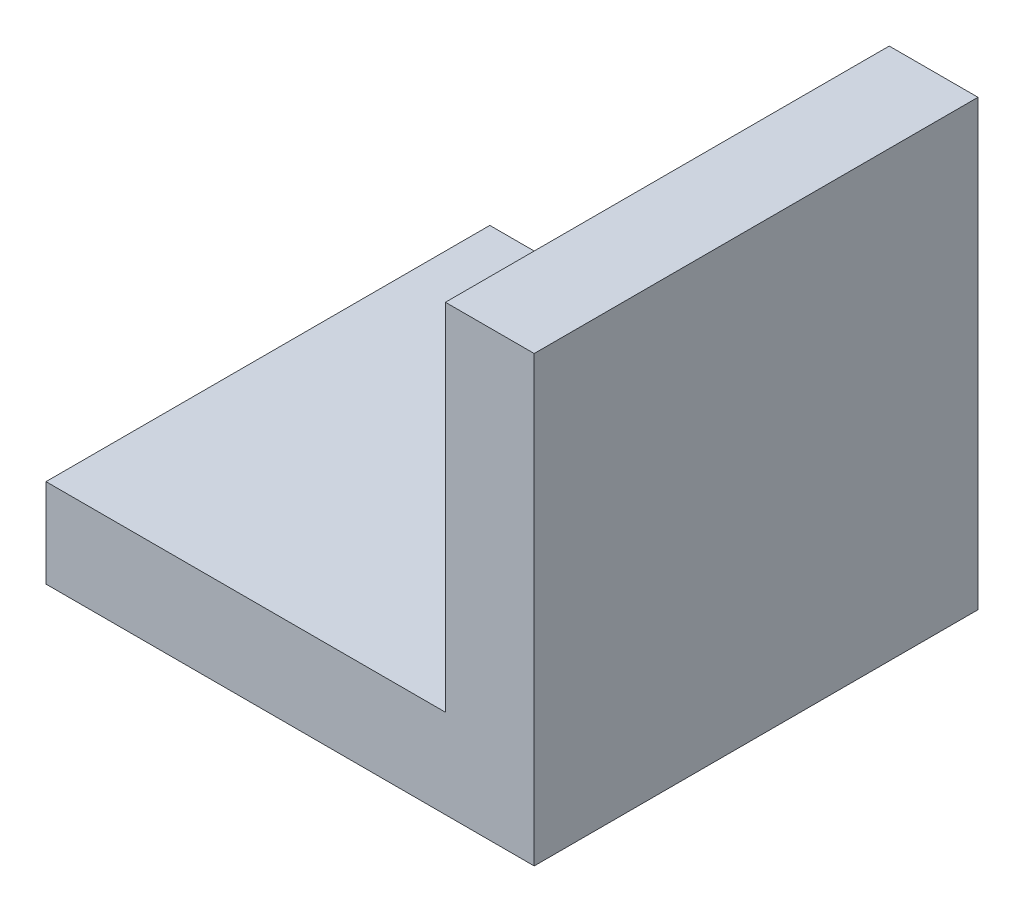
ISO-10303-21;
HEADER;
FILE_DESCRIPTION(('STEP AP214'),'2;1');
FILE_NAME('part.step','',(''),(''),'','','');
FILE_SCHEMA(('AUTOMOTIVE_DESIGN { 1 0 10303 214 1 1 1 1 }'));
ENDSEC;
DATA;
#1=APPLICATION_CONTEXT('core data for automotive mechanical design processes');
#2=APPLICATION_PROTOCOL_DEFINITION('international standard','automotive_design',2000,#1);
#3=PRODUCT_CONTEXT('',#1,'mechanical');
#4=PRODUCT('Part','Part','',(#3));
#5=PRODUCT_RELATED_PRODUCT_CATEGORY('part','',(#4));
#6=PRODUCT_DEFINITION_FORMATION('','',#4);
#7=PRODUCT_DEFINITION_CONTEXT('part definition',#1,'design');
#8=PRODUCT_DEFINITION('design','',#6,#7);
#9=PRODUCT_DEFINITION_SHAPE('','',#8);
#10=(LENGTH_UNIT() NAMED_UNIT(*) SI_UNIT(.MILLI.,.METRE.));
#11=(NAMED_UNIT(*) PLANE_ANGLE_UNIT() SI_UNIT($,.RADIAN.));
#12=(NAMED_UNIT(*) SI_UNIT($,.STERADIAN.) SOLID_ANGLE_UNIT());
#13=UNCERTAINTY_MEASURE_WITH_UNIT(LENGTH_MEASURE(1.E-05),#10,'distance_accuracy_value','');
#14=(GEOMETRIC_REPRESENTATION_CONTEXT(3) GLOBAL_UNCERTAINTY_ASSIGNED_CONTEXT((#13)) GLOBAL_UNIT_ASSIGNED_CONTEXT((#10,
#11,#12)) REPRESENTATION_CONTEXT('',''));
#15=CARTESIAN_POINT('',(0.,0.,0.));
#16=DIRECTION('',(0.,0.,1.));
#17=DIRECTION('',(1.,0.,0.));
#18=AXIS2_PLACEMENT_3D('',#15,#16,#17);
#19=CARTESIAN_POINT('',(0.,50.,50.));
#20=DIRECTION('',(-1.,0.,0.));
#21=DIRECTION('',(0.,0.,1.));
#22=AXIS2_PLACEMENT_3D('',#19,#20,#21);
#23=PLANE('',#22);
#24=DIRECTION('',(0.,1.,0.));
#25=VECTOR('',#24,1.);
#26=CARTESIAN_POINT('',(0.,50.,0.));
#27=LINE('',#26,#25);
#28=CARTESIAN_POINT('',(0.,0.,0.));
#29=VERTEX_POINT('',#28);
#30=CARTESIAN_POINT('',(0.,50.,0.));
#31=VERTEX_POINT('',#30);
#32=EDGE_CURVE('E117',#29,#31,#27,.T.);
#33=ORIENTED_EDGE('',*,*,#32,.T.);
#34=DIRECTION('',(0.,0.,-1.));
#35=VECTOR('',#34,1.);
#36=CARTESIAN_POINT('',(0.,50.,50.));
#37=LINE('',#36,#35);
#38=CARTESIAN_POINT('',(0.,50.,50.));
#39=VERTEX_POINT('',#38);
#40=EDGE_CURVE('E11',#39,#31,#37,.T.);
#41=ORIENTED_EDGE('',*,*,#40,.F.);
#42=DIRECTION('',(0.,1.,0.));
#43=VECTOR('',#42,1.);
#44=CARTESIAN_POINT('',(0.,50.,50.));
#45=LINE('',#44,#43);
#46=CARTESIAN_POINT('',(0.,0.,50.));
#47=VERTEX_POINT('',#46);
#48=EDGE_CURVE('E127',#47,#39,#45,.T.);
#49=ORIENTED_EDGE('',*,*,#48,.F.);
#50=DIRECTION('',(0.,0.,-1.));
#51=VECTOR('',#50,1.);
#52=CARTESIAN_POINT('',(0.,0.,50.));
#53=LINE('',#52,#51);
#54=EDGE_CURVE('E113',#47,#29,#53,.T.);
#55=ORIENTED_EDGE('',*,*,#54,.T.);
#56=EDGE_LOOP('',(#33,#41,#49,#55));
#57=FACE_BOUND('',#56,.T.);
#58=ADVANCED_FACE('F33',(#57),#23,.F.);
#59=CARTESIAN_POINT('',(-10.,50.,50.));
#60=DIRECTION('',(0.,-1.,0.));
#61=DIRECTION('',(0.,0.,-1.));
#62=AXIS2_PLACEMENT_3D('',#59,#60,#61);
#63=PLANE('',#62);
#64=DIRECTION('',(-1.,0.,0.));
#65=VECTOR('',#64,1.);
#66=CARTESIAN_POINT('',(-10.,50.,0.));
#67=LINE('',#66,#65);
#68=CARTESIAN_POINT('',(-10.,50.,0.));
#69=VERTEX_POINT('',#68);
#70=EDGE_CURVE('E120',#31,#69,#67,.T.);
#71=ORIENTED_EDGE('',*,*,#70,.T.);
#72=DIRECTION('',(0.,0.,-1.));
#73=VECTOR('',#72,1.);
#74=CARTESIAN_POINT('',(-10.,50.,50.));
#75=LINE('',#74,#73);
#76=CARTESIAN_POINT('',(-10.,50.,50.));
#77=VERTEX_POINT('',#76);
#78=EDGE_CURVE('E41',#77,#69,#75,.T.);
#79=ORIENTED_EDGE('',*,*,#78,.F.);
#80=DIRECTION('',(-1.,0.,0.));
#81=VECTOR('',#80,1.);
#82=CARTESIAN_POINT('',(-10.,50.,50.));
#83=LINE('',#82,#81);
#84=EDGE_CURVE('E86',#39,#77,#83,.T.);
#85=ORIENTED_EDGE('',*,*,#84,.F.);
#86=ORIENTED_EDGE('',*,*,#40,.T.);
#87=EDGE_LOOP('',(#71,#79,#85,#86));
#88=FACE_BOUND('',#87,.T.);
#89=ADVANCED_FACE('F151',(#88),#63,.F.);
#90=CARTESIAN_POINT('',(-10.,9.99999999999999,50.));
#91=DIRECTION('',(1.,0.,0.));
#92=DIRECTION('',(0.,1.,0.));
#93=AXIS2_PLACEMENT_3D('',#90,#91,#92);
#94=PLANE('',#93);
#95=DIRECTION('',(0.,-1.,0.));
#96=VECTOR('',#95,1.);
#97=CARTESIAN_POINT('',(-10.,9.99999999999999,0.));
#98=LINE('',#97,#96);
#99=CARTESIAN_POINT('',(-10.,9.99999999999999,0.));
#100=VERTEX_POINT('',#99);
#101=EDGE_CURVE('E122',#69,#100,#98,.T.);
#102=ORIENTED_EDGE('',*,*,#101,.T.);
#103=DIRECTION('',(0.,0.,-1.));
#104=VECTOR('',#103,1.);
#105=CARTESIAN_POINT('',(-10.,9.99999999999999,50.));
#106=LINE('',#105,#104);
#107=CARTESIAN_POINT('',(-10.,9.99999999999999,50.));
#108=VERTEX_POINT('',#107);
#109=EDGE_CURVE('E108',#108,#100,#106,.T.);
#110=ORIENTED_EDGE('',*,*,#109,.F.);
#111=DIRECTION('',(0.,-1.,0.));
#112=VECTOR('',#111,1.);
#113=CARTESIAN_POINT('',(-10.,9.99999999999999,50.));
#114=LINE('',#113,#112);
#115=EDGE_CURVE('E99',#77,#108,#114,.T.);
#116=ORIENTED_EDGE('',*,*,#115,.F.);
#117=ORIENTED_EDGE('',*,*,#78,.T.);
#118=EDGE_LOOP('',(#102,#110,#116,#117));
#119=FACE_BOUND('',#118,.T.);
#120=ADVANCED_FACE('F133',(#119),#94,.F.);
#121=CARTESIAN_POINT('',(-55.,9.99999999999999,50.));
#122=DIRECTION('',(0.,-1.,0.));
#123=DIRECTION('',(0.,0.,-1.));
#124=AXIS2_PLACEMENT_3D('',#121,#122,#123);
#125=PLANE('',#124);
#126=DIRECTION('',(-1.,0.,0.));
#127=VECTOR('',#126,1.);
#128=CARTESIAN_POINT('',(-55.,9.99999999999999,0.));
#129=LINE('',#128,#127);
#130=CARTESIAN_POINT('',(-55.,9.99999999999999,0.));
#131=VERTEX_POINT('',#130);
#132=EDGE_CURVE('E107',#100,#131,#129,.T.);
#133=ORIENTED_EDGE('',*,*,#132,.T.);
#134=DIRECTION('',(0.,0.,-1.));
#135=VECTOR('',#134,1.);
#136=CARTESIAN_POINT('',(-55.,9.99999999999999,50.));
#137=LINE('',#136,#135);
#138=CARTESIAN_POINT('',(-55.,9.99999999999999,50.));
#139=VERTEX_POINT('',#138);
#140=EDGE_CURVE('E104',#139,#131,#137,.T.);
#141=ORIENTED_EDGE('',*,*,#140,.F.);
#142=DIRECTION('',(-1.,0.,0.));
#143=VECTOR('',#142,1.);
#144=CARTESIAN_POINT('',(-55.,9.99999999999999,50.));
#145=LINE('',#144,#143);
#146=EDGE_CURVE('E93',#108,#139,#145,.T.);
#147=ORIENTED_EDGE('',*,*,#146,.F.);
#148=ORIENTED_EDGE('',*,*,#109,.T.);
#149=EDGE_LOOP('',(#133,#141,#147,#148));
#150=FACE_BOUND('',#149,.T.);
#151=ADVANCED_FACE('F105',(#150),#125,.F.);
#152=CARTESIAN_POINT('',(-55.,0.,50.));
#153=DIRECTION('',(1.,0.,0.));
#154=DIRECTION('',(0.,0.,-1.));
#155=AXIS2_PLACEMENT_3D('',#152,#153,#154);
#156=PLANE('',#155);
#157=DIRECTION('',(0.,-1.,0.));
#158=VECTOR('',#157,1.);
#159=CARTESIAN_POINT('',(-55.,0.,0.));
#160=LINE('',#159,#158);
#161=CARTESIAN_POINT('',(-55.,0.,0.));
#162=VERTEX_POINT('',#161);
#163=EDGE_CURVE('E72',#131,#162,#160,.T.);
#164=ORIENTED_EDGE('',*,*,#163,.T.);
#165=DIRECTION('',(0.,0.,-1.));
#166=VECTOR('',#165,1.);
#167=CARTESIAN_POINT('',(-55.,0.,50.));
#168=LINE('',#167,#166);
#169=CARTESIAN_POINT('',(-55.,0.,50.));
#170=VERTEX_POINT('',#169);
#171=EDGE_CURVE('E109',#170,#162,#168,.T.);
#172=ORIENTED_EDGE('',*,*,#171,.F.);
#173=DIRECTION('',(0.,-1.,0.));
#174=VECTOR('',#173,1.);
#175=CARTESIAN_POINT('',(-55.,0.,50.));
#176=LINE('',#175,#174);
#177=EDGE_CURVE('E97',#139,#170,#176,.T.);
#178=ORIENTED_EDGE('',*,*,#177,.F.);
#179=ORIENTED_EDGE('',*,*,#140,.T.);
#180=EDGE_LOOP('',(#164,#172,#178,#179));
#181=FACE_BOUND('',#180,.T.);
#182=ADVANCED_FACE('F111',(#181),#156,.F.);
#183=CARTESIAN_POINT('',(0.,0.,50.));
#184=DIRECTION('',(0.,1.,0.));
#185=DIRECTION('',(0.,0.,1.));
#186=AXIS2_PLACEMENT_3D('',#183,#184,#185);
#187=PLANE('',#186);
#188=DIRECTION('',(1.,0.,0.));
#189=VECTOR('',#188,1.);
#190=CARTESIAN_POINT('',(0.,0.,0.));
#191=LINE('',#190,#189);
#192=EDGE_CURVE('E78',#162,#29,#191,.T.);
#193=ORIENTED_EDGE('',*,*,#192,.T.);
#194=ORIENTED_EDGE('',*,*,#54,.F.);
#195=DIRECTION('',(1.,0.,0.));
#196=VECTOR('',#195,1.);
#197=CARTESIAN_POINT('',(0.,0.,50.));
#198=LINE('',#197,#196);
#199=EDGE_CURVE('E49',#170,#47,#198,.T.);
#200=ORIENTED_EDGE('',*,*,#199,.F.);
#201=ORIENTED_EDGE('',*,*,#171,.T.);
#202=EDGE_LOOP('',(#193,#194,#200,#201));
#203=FACE_BOUND('',#202,.T.);
#204=ADVANCED_FACE('F140',(#203),#187,.F.);
#205=CARTESIAN_POINT('',(0.,0.,50.));
#206=DIRECTION('',(0.,0.,-1.));
#207=DIRECTION('',(-1.,0.,0.));
#208=AXIS2_PLACEMENT_3D('',#205,#206,#207);
#209=PLANE('',#208);
#210=ORIENTED_EDGE('',*,*,#48,.T.);
#211=ORIENTED_EDGE('',*,*,#84,.T.);
#212=ORIENTED_EDGE('',*,*,#115,.T.);
#213=ORIENTED_EDGE('',*,*,#146,.T.);
#214=ORIENTED_EDGE('',*,*,#177,.T.);
#215=ORIENTED_EDGE('',*,*,#199,.T.);
#216=EDGE_LOOP('',(#210,#211,#212,#213,#214,#215));
#217=FACE_BOUND('',#216,.T.);
#218=ADVANCED_FACE('F95',(#217),#209,.F.);
#219=CARTESIAN_POINT('',(0.,0.,0.));
#220=DIRECTION('',(0.,0.,-1.));
#221=DIRECTION('',(-1.,0.,0.));
#222=AXIS2_PLACEMENT_3D('',#219,#220,#221);
#223=PLANE('',#222);
#224=ORIENTED_EDGE('',*,*,#32,.F.);
#225=ORIENTED_EDGE('',*,*,#192,.F.);
#226=ORIENTED_EDGE('',*,*,#163,.F.);
#227=ORIENTED_EDGE('',*,*,#132,.F.);
#228=ORIENTED_EDGE('',*,*,#101,.F.);
#229=ORIENTED_EDGE('',*,*,#70,.F.);
#230=EDGE_LOOP('',(#224,#225,#226,#227,#228,#229));
#231=FACE_BOUND('',#230,.T.);
#232=ADVANCED_FACE('F136',(#231),#223,.T.);
#233=CLOSED_SHELL('',(#58,#89,#120,#151,#182,#204,#218,#232));
#234=MANIFOLD_SOLID_BREP('B2',#233);
#235=ADVANCED_BREP_SHAPE_REPRESENTATION('',(#18,#234),#14);
#236=SHAPE_DEFINITION_REPRESENTATION(#9,#235);
ENDSEC;
END-ISO-10303-21;
